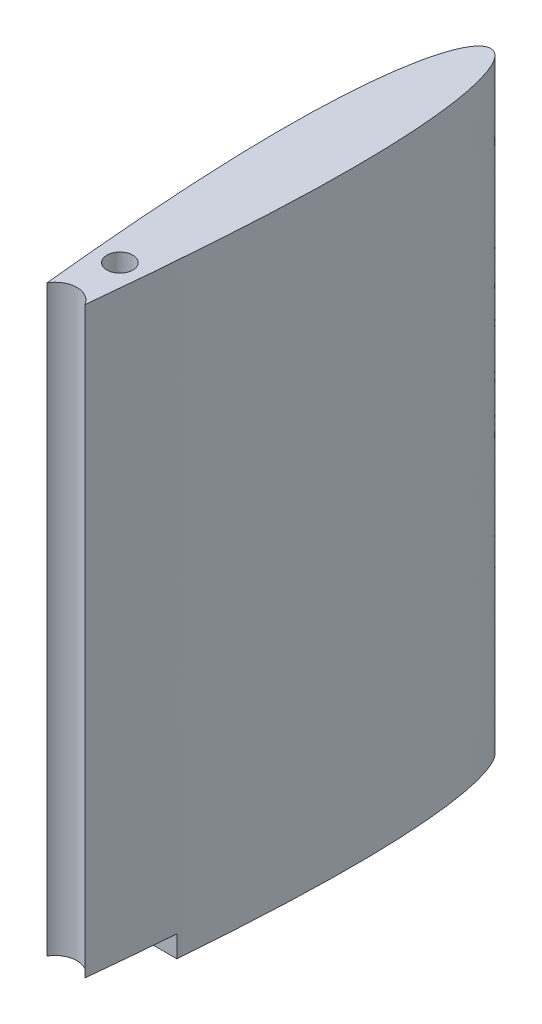
ISO-10303-21;
HEADER;
FILE_DESCRIPTION(('STEP AP214'),'2;1');
FILE_NAME('part.step','',(''),(''),'','','');
FILE_SCHEMA(('AUTOMOTIVE_DESIGN { 1 0 10303 214 1 1 1 1 }'));
ENDSEC;
DATA;
#1=APPLICATION_CONTEXT('core data for automotive mechanical design processes');
#2=APPLICATION_PROTOCOL_DEFINITION('international standard','automotive_design',2000,#1);
#3=PRODUCT_CONTEXT('',#1,'mechanical');
#4=PRODUCT('Part','Part','',(#3));
#5=PRODUCT_RELATED_PRODUCT_CATEGORY('part','',(#4));
#6=PRODUCT_DEFINITION_FORMATION('','',#4);
#7=PRODUCT_DEFINITION_CONTEXT('part definition',#1,'design');
#8=PRODUCT_DEFINITION('design','',#6,#7);
#9=PRODUCT_DEFINITION_SHAPE('','',#8);
#10=(LENGTH_UNIT() NAMED_UNIT(*) SI_UNIT(.MILLI.,.METRE.));
#11=(NAMED_UNIT(*) PLANE_ANGLE_UNIT() SI_UNIT($,.RADIAN.));
#12=(NAMED_UNIT(*) SI_UNIT($,.STERADIAN.) SOLID_ANGLE_UNIT());
#13=UNCERTAINTY_MEASURE_WITH_UNIT(LENGTH_MEASURE(1.E-05),#10,'distance_accuracy_value','');
#14=(GEOMETRIC_REPRESENTATION_CONTEXT(3) GLOBAL_UNCERTAINTY_ASSIGNED_CONTEXT((#13)) GLOBAL_UNIT_ASSIGNED_CONTEXT((#10,
#11,#12)) REPRESENTATION_CONTEXT('',''));
#15=CARTESIAN_POINT('',(0.,0.,0.));
#16=DIRECTION('',(0.,0.,1.));
#17=DIRECTION('',(1.,0.,0.));
#18=AXIS2_PLACEMENT_3D('',#15,#16,#17);
#19=CARTESIAN_POINT('',(0.,0.,51.933943359019));
#20=DIRECTION('',(0.,1.,0.));
#21=DIRECTION('',(0.,0.,1.));
#22=AXIS2_PLACEMENT_3D('',#19,#20,#21);
#23=CYLINDRICAL_SURFACE('',#22,5.04565714195597);
#24=DIRECTION('',(0.,1.,0.));
#25=VECTOR('',#24,1.);
#26=CARTESIAN_POINT('',(-4.38276807442184,0.,49.433943359019));
#27=LINE('',#26,#25);
#28=CARTESIAN_POINT('',(-4.38276807442184,5.,49.433943359019));
#29=VERTEX_POINT('',#28);
#30=CARTESIAN_POINT('',(-4.38276807442184,140.,49.433943359019));
#31=VERTEX_POINT('',#30);
#32=EDGE_CURVE('E54',#29,#31,#27,.T.);
#33=ORIENTED_EDGE('',*,*,#32,.F.);
#34=CARTESIAN_POINT('',(0.,5.,51.933943359019));
#35=DIRECTION('',(0.,-1.,0.));
#36=DIRECTION('',(0.,0.,-1.));
#37=AXIS2_PLACEMENT_3D('',#34,#35,#36);
#38=CIRCLE('',#37,5.04565714195597);
#39=CARTESIAN_POINT('',(4.38276807442184,5.,49.433943359019));
#40=VERTEX_POINT('',#39);
#41=EDGE_CURVE('E344',#40,#29,#38,.F.);
#42=ORIENTED_EDGE('',*,*,#41,.F.);
#43=DIRECTION('',(0.,1.,0.));
#44=VECTOR('',#43,1.);
#45=CARTESIAN_POINT('',(4.38276807442184,0.,49.433943359019));
#46=LINE('',#45,#44);
#47=CARTESIAN_POINT('',(4.38276807442184,140.,49.433943359019));
#48=VERTEX_POINT('',#47);
#49=EDGE_CURVE('E731',#40,#48,#46,.T.);
#50=ORIENTED_EDGE('',*,*,#49,.T.);
#51=CARTESIAN_POINT('',(0.,140.,51.933943359019));
#52=DIRECTION('',(0.,-1.,0.));
#53=DIRECTION('',(0.,0.,1.));
#54=AXIS2_PLACEMENT_3D('',#51,#52,#53);
#55=CIRCLE('',#54,5.04565714195597);
#56=EDGE_CURVE('E11',#31,#48,#55,.T.);
#57=ORIENTED_EDGE('',*,*,#56,.F.);
#58=EDGE_LOOP('',(#33,#42,#50,#57));
#59=FACE_BOUND('',#58,.T.);
#60=ADVANCED_FACE('F44',(#59),#23,.F.);
#61=CARTESIAN_POINT('',(0.,0.,-48.9294211031806));
#62=DIRECTION('',(0.,-1.,0.));
#63=DIRECTION('',(0.,0.,-1.));
#64=AXIS2_PLACEMENT_3D('',#61,#62,#63);
#65=PLANE('',#64);
#66=CARTESIAN_POINT('',(0.,0.,-23.9294211031806));
#67=DIRECTION('',(0.,-1.,0.));
#68=DIRECTION('',(0.,0.,-1.));
#69=AXIS2_PLACEMENT_3D('',#66,#67,#68);
#70=CIRCLE('',#69,2.5);
#71=CARTESIAN_POINT('',(0.,0.,-26.4294211031806));
#72=VERTEX_POINT('',#71);
#73=EDGE_CURVE('E303',#72,#72,#70,.T.);
#74=ORIENTED_EDGE('',*,*,#73,.F.);
#75=EDGE_LOOP('',(#74));
#76=FACE_BOUND('',#75,.T.);
#77=CARTESIAN_POINT('',(0.,0.,11.0705788968194));
#78=DIRECTION('',(0.,-1.,0.));
#79=DIRECTION('',(0.,0.,-1.));
#80=AXIS2_PLACEMENT_3D('',#77,#78,#79);
#81=CIRCLE('',#80,2.49999999999999);
#82=CARTESIAN_POINT('',(0.,0.,8.57057889681938));
#83=VERTEX_POINT('',#82);
#84=EDGE_CURVE('E307',#83,#83,#81,.T.);
#85=ORIENTED_EDGE('',*,*,#84,.F.);
#86=EDGE_LOOP('',(#85));
#87=FACE_BOUND('',#86,.T.);
#88=DIRECTION('',(0.999999999996919,0.,-2.48249848386067E-06));
#89=VECTOR('',#88,1.);
#90=CARTESIAN_POINT('',(7.43109690043385E-05,0.,29.9339433587668));
#91=LINE('',#90,#89);
#92=CARTESIAN_POINT('',(-6.18088512114078,0.,29.9339586936792));
#93=VERTEX_POINT('',#92);
#94=CARTESIAN_POINT('',(6.18087194615016,0.,29.9339280344539));
#95=VERTEX_POINT('',#94);
#96=EDGE_CURVE('E319',#93,#95,#91,.T.);
#97=ORIENTED_EDGE('',*,*,#96,.F.);
#98=CARTESIAN_POINT('',(4.38276807442184,0.,49.433943359019));
#99=CARTESIAN_POINT('',(7.38674027737207,0.,20.1143201093682));
#100=CARTESIAN_POINT('',(7.89819411540561,0.,-0.782057388597716));
#101=CARTESIAN_POINT('',(8.25280627032264,0.,-15.2703824405782));
#102=CARTESIAN_POINT('',(7.39775077923337,0.,-25.941839105154));
#103=CARTESIAN_POINT('',(6.8180483419731,0.,-33.1767723954968));
#104=CARTESIAN_POINT('',(5.71240319510673,0.,-38.4086579483097));
#105=CARTESIAN_POINT('',(4.94963666341469,0.,-42.0180503547607));
#106=CARTESIAN_POINT('',(3.98237547497152,0.,-44.4540468477512));
#107=CARTESIAN_POINT('',(2.20585284896571,0.,-48.9281257608461));
#108=CARTESIAN_POINT('',(0.,0.,-48.9294211031806));
#109=CARTESIAN_POINT('',(-2.20430363336308,0.,-48.9307155357698));
#110=CARTESIAN_POINT('',(-3.98237547497156,0.,-44.4540468477511));
#111=CARTESIAN_POINT('',(-4.94901413811265,0.,-42.0203313281368));
#112=CARTESIAN_POINT('',(-5.71240319510677,0.,-38.4086579483096));
#113=CARTESIAN_POINT('',(-6.81774983754667,0.,-33.1791475074594));
#114=CARTESIAN_POINT('',(-7.39775077923339,0.,-25.9418391051539));
#115=CARTESIAN_POINT('',(-8.25277773893857,0.,-15.2727291866837));
#116=CARTESIAN_POINT('',(-7.89819411540561,0.,-0.782057388597478));
#117=CARTESIAN_POINT('',(-7.38690314969791,0.,20.1127304292302));
#118=CARTESIAN_POINT('',(-4.38276807442184,0.,49.433943359019));
#119=B_SPLINE_CURVE_WITH_KNOTS('',2,(#98,#99,#100,#101,#102,#103,#104,#105,#106,#107,#108,#109,
#110,#111,#112,#113,#114,#115,#116,#117,#118),.UNSPECIFIED.,.F.,.F.,(3,2,2,2,2,2,2,2,2,2,3),(0.,
0.25,0.375,0.4375,0.46875,0.5,0.53125,0.5625,0.625,0.75,1.),.UNSPECIFIED.);
#120=EDGE_CURVE('E728',#95,#93,#119,.T.);
#121=ORIENTED_EDGE('',*,*,#120,.F.);
#122=EDGE_LOOP('',(#97,#121));
#123=FACE_BOUND('',#122,.T.);
#124=ADVANCED_FACE('F46',(#76,#87,#123),#65,.T.);
#125=CARTESIAN_POINT('',(0.,140.,-48.9294211031806));
#126=DIRECTION('',(0.,-1.,0.));
#127=DIRECTION('',(0.,0.,-1.));
#128=AXIS2_PLACEMENT_3D('',#125,#126,#127);
#129=PLANE('',#128);
#130=CARTESIAN_POINT('',(0.,140.,36.933943359019));
#131=DIRECTION('',(0.,1.,0.));
#132=DIRECTION('',(0.,0.,1.));
#133=AXIS2_PLACEMENT_3D('',#130,#131,#132);
#134=CIRCLE('',#133,3.);
#135=CARTESIAN_POINT('',(0.,140.,39.933943359019));
#136=VERTEX_POINT('',#135);
#137=EDGE_CURVE('E354',#136,#136,#134,.T.);
#138=ORIENTED_EDGE('',*,*,#137,.F.);
#139=EDGE_LOOP('',(#138));
#140=FACE_BOUND('',#139,.T.);
#141=CARTESIAN_POINT('',(4.38276807442184,140.,49.433943359019));
#142=CARTESIAN_POINT('',(7.38674027737207,140.,20.1143201093682));
#143=CARTESIAN_POINT('',(7.89819411540561,140.,-0.782057388597716));
#144=CARTESIAN_POINT('',(8.25280627032264,140.,-15.2703824405782));
#145=CARTESIAN_POINT('',(7.39775077923337,140.,-25.941839105154));
#146=CARTESIAN_POINT('',(6.8180483419731,140.,-33.1767723954968));
#147=CARTESIAN_POINT('',(5.71240319510673,140.,-38.4086579483097));
#148=CARTESIAN_POINT('',(4.94963666341469,140.,-42.0180503547607));
#149=CARTESIAN_POINT('',(3.98237547497152,140.,-44.4540468477512));
#150=CARTESIAN_POINT('',(2.20585284896571,140.,-48.9281257608461));
#151=CARTESIAN_POINT('',(0.,140.,-48.9294211031806));
#152=CARTESIAN_POINT('',(-2.20430363336308,140.,-48.9307155357698));
#153=CARTESIAN_POINT('',(-3.98237547497156,140.,-44.4540468477511));
#154=CARTESIAN_POINT('',(-4.94901413811265,140.,-42.0203313281368));
#155=CARTESIAN_POINT('',(-5.71240319510677,140.,-38.4086579483096));
#156=CARTESIAN_POINT('',(-6.81774983754667,140.,-33.1791475074594));
#157=CARTESIAN_POINT('',(-7.39775077923339,140.,-25.9418391051539));
#158=CARTESIAN_POINT('',(-8.25277773893857,140.,-15.2727291866837));
#159=CARTESIAN_POINT('',(-7.89819411540561,140.,-0.782057388597478));
#160=CARTESIAN_POINT('',(-7.38690314969791,140.,20.1127304292302));
#161=CARTESIAN_POINT('',(-4.38276807442184,140.,49.433943359019));
#162=B_SPLINE_CURVE_WITH_KNOTS('',2,(#141,#142,#143,#144,#145,#146,#147,#148,#149,#150,#151,
#152,#153,#154,#155,#156,#157,#158,#159,#160,#161),.UNSPECIFIED.,.F.,.F.,(3,2,2,2,2,2,2,2,2,2,
3),(0.,0.25,0.375,0.4375,0.46875,0.5,0.53125,0.5625,0.625,0.75,1.),.UNSPECIFIED.);
#163=EDGE_CURVE('E736',#48,#31,#162,.T.);
#164=ORIENTED_EDGE('',*,*,#163,.T.);
#165=ORIENTED_EDGE('',*,*,#56,.T.);
#166=EDGE_LOOP('',(#164,#165));
#167=FACE_BOUND('',#166,.T.);
#168=ADVANCED_FACE('F402',(#140,#167),#129,.F.);
#169=CARTESIAN_POINT('',(4.38276807442184,0.,49.433943359019));
#170=CARTESIAN_POINT('',(4.38276807442184,140.,49.433943359019));
#171=CARTESIAN_POINT('',(7.38674027737207,0.,20.1143201093682));
#172=CARTESIAN_POINT('',(7.38674027737207,140.,20.1143201093682));
#173=CARTESIAN_POINT('',(7.89819411540561,0.,-0.782057388597716));
#174=CARTESIAN_POINT('',(7.89819411540561,140.,-0.782057388597716));
#175=CARTESIAN_POINT('',(8.25280627032264,0.,-15.2703824405782));
#176=CARTESIAN_POINT('',(8.25280627032264,140.,-15.2703824405782));
#177=CARTESIAN_POINT('',(7.39775077923337,0.,-25.941839105154));
#178=CARTESIAN_POINT('',(7.39775077923337,140.,-25.941839105154));
#179=CARTESIAN_POINT('',(6.8180483419731,0.,-33.1767723954968));
#180=CARTESIAN_POINT('',(6.8180483419731,140.,-33.1767723954968));
#181=CARTESIAN_POINT('',(5.71240319510673,0.,-38.4086579483097));
#182=CARTESIAN_POINT('',(5.71240319510673,140.,-38.4086579483097));
#183=CARTESIAN_POINT('',(4.94963666341469,0.,-42.0180503547607));
#184=CARTESIAN_POINT('',(4.94963666341469,140.,-42.0180503547607));
#185=CARTESIAN_POINT('',(3.98237547497152,0.,-44.4540468477512));
#186=CARTESIAN_POINT('',(3.98237547497152,140.,-44.4540468477512));
#187=CARTESIAN_POINT('',(2.20585284896571,0.,-48.9281257608461));
#188=CARTESIAN_POINT('',(2.20585284896571,140.,-48.9281257608461));
#189=CARTESIAN_POINT('',(0.,0.,-48.9294211031806));
#190=CARTESIAN_POINT('',(0.,140.,-48.9294211031806));
#191=CARTESIAN_POINT('',(-2.20430363336308,0.,-48.9307155357698));
#192=CARTESIAN_POINT('',(-2.20430363336308,140.,-48.9307155357698));
#193=CARTESIAN_POINT('',(-3.98237547497156,0.,-44.4540468477511));
#194=CARTESIAN_POINT('',(-3.98237547497156,140.,-44.4540468477511));
#195=CARTESIAN_POINT('',(-4.94901413811265,0.,-42.0203313281368));
#196=CARTESIAN_POINT('',(-4.94901413811265,140.,-42.0203313281368));
#197=CARTESIAN_POINT('',(-5.71240319510677,0.,-38.4086579483096));
#198=CARTESIAN_POINT('',(-5.71240319510677,140.,-38.4086579483096));
#199=CARTESIAN_POINT('',(-6.81774983754667,0.,-33.1791475074594));
#200=CARTESIAN_POINT('',(-6.81774983754667,140.,-33.1791475074594));
#201=CARTESIAN_POINT('',(-7.39775077923339,0.,-25.9418391051539));
#202=CARTESIAN_POINT('',(-7.39775077923339,140.,-25.9418391051539));
#203=CARTESIAN_POINT('',(-8.25277773893857,0.,-15.2727291866837));
#204=CARTESIAN_POINT('',(-8.25277773893857,140.,-15.2727291866837));
#205=CARTESIAN_POINT('',(-7.89819411540561,0.,-0.782057388597478));
#206=CARTESIAN_POINT('',(-7.89819411540561,140.,-0.782057388597478));
#207=CARTESIAN_POINT('',(-7.38690314969791,0.,20.1127304292302));
#208=CARTESIAN_POINT('',(-7.38690314969791,140.,20.1127304292302));
#209=CARTESIAN_POINT('',(-4.38276807442184,0.,49.433943359019));
#210=CARTESIAN_POINT('',(-4.38276807442184,140.,49.433943359019));
#211=B_SPLINE_SURFACE_WITH_KNOTS('',2,1,((#169,#170),(#171,#172),(#173,#174),(#175,#176),(#177,
#178),(#179,#180),(#181,#182),(#183,#184),(#185,#186),(#187,#188),(#189,#190),(#191,#192),(#193,
#194),(#195,#196),(#197,#198),(#199,#200),(#201,#202),(#203,#204),(#205,#206),(#207,#208),(#209,
#210)),.UNSPECIFIED.,.F.,.F.,.F.,(3,2,2,2,2,2,2,2,2,2,3),(2,2),(0.,0.25,0.375,0.4375,0.46875,
0.5,0.53125,0.5625,0.625,0.75,1.),(0.,1.),.UNSPECIFIED.);
#212=DIRECTION('',(0.,-1.,0.));
#213=VECTOR('',#212,1.);
#214=CARTESIAN_POINT('',(6.18087194615016,5.,29.9339280344539));
#215=LINE('',#214,#213);
#216=CARTESIAN_POINT('',(6.18087194615016,5.,29.9339280344539));
#217=VERTEX_POINT('',#216);
#218=EDGE_CURVE('E343',#217,#95,#215,.T.);
#219=DIRECTION('',(0.,-1.,0.));
#220=VECTOR('',#219,1.);
#221=CARTESIAN_POINT('',(-6.18088512114078,5.,29.9339586936792));
#222=LINE('',#221,#220);
#223=CARTESIAN_POINT('',(-6.18088512114078,5.,29.9339586936792));
#224=VERTEX_POINT('',#223);
#225=EDGE_CURVE('E340',#224,#93,#222,.T.);
#226=CARTESIAN_POINT('',(-4.38276807442184,5.,49.433943359019));
#227=CARTESIAN_POINT('',(-7.38690314969791,5.,20.1127304292302));
#228=CARTESIAN_POINT('',(-7.89819411540561,5.,-0.782057388597478));
#229=CARTESIAN_POINT('',(-8.25277773893857,5.,-15.2727291866837));
#230=CARTESIAN_POINT('',(-7.39775077923339,5.,-25.9418391051539));
#231=CARTESIAN_POINT('',(-6.81774983754667,5.,-33.1791475074594));
#232=CARTESIAN_POINT('',(-5.71240319510677,5.,-38.4086579483096));
#233=CARTESIAN_POINT('',(-4.94901413811265,5.,-42.0203313281368));
#234=CARTESIAN_POINT('',(-3.98237547497156,5.,-44.4540468477511));
#235=CARTESIAN_POINT('',(-2.20430363336308,5.,-48.9307155357698));
#236=CARTESIAN_POINT('',(0.,5.,-48.9294211031806));
#237=CARTESIAN_POINT('',(2.20585284896571,5.,-48.9281257608461));
#238=CARTESIAN_POINT('',(3.98237547497152,5.,-44.4540468477512));
#239=CARTESIAN_POINT('',(4.94963666341469,5.,-42.0180503547607));
#240=CARTESIAN_POINT('',(5.71240319510673,5.,-38.4086579483097));
#241=CARTESIAN_POINT('',(6.8180483419731,5.,-33.1767723954968));
#242=CARTESIAN_POINT('',(7.39775077923337,5.,-25.941839105154));
#243=CARTESIAN_POINT('',(8.25280627032264,5.,-15.2703824405782));
#244=CARTESIAN_POINT('',(7.89819411540561,5.,-0.782057388597716));
#245=CARTESIAN_POINT('',(7.38674027737207,5.,20.1143201093682));
#246=CARTESIAN_POINT('',(4.38276807442184,5.,49.433943359019));
#247=B_SPLINE_CURVE_WITH_KNOTS('',2,(#226,#227,#228,#229,#230,#231,#232,#233,#234,#235,#236,
#237,#238,#239,#240,#241,#242,#243,#244,#245,#246),.UNSPECIFIED.,.F.,.F.,(3,2,2,2,2,2,2,2,2,2,
3),(0.,0.25,0.375,0.4375,0.46875,0.5,0.53125,0.5625,0.625,0.75,1.),.UNSPECIFIED.);
#248=EDGE_CURVE('E336',#29,#224,#247,.T.);
#249=EDGE_CURVE('E62',#217,#40,#247,.T.);
#250=ORIENTED_EDGE('',*,*,#218,.T.);
#251=ORIENTED_EDGE('',*,*,#120,.T.);
#252=ORIENTED_EDGE('',*,*,#225,.F.);
#253=ORIENTED_EDGE('',*,*,#248,.F.);
#254=ORIENTED_EDGE('',*,*,#32,.T.);
#255=ORIENTED_EDGE('',*,*,#163,.F.);
#256=ORIENTED_EDGE('',*,*,#49,.F.);
#257=ORIENTED_EDGE('',*,*,#249,.F.);
#258=EDGE_LOOP('',(#250,#251,#252,#253,#254,#255,#256,#257));
#259=FACE_BOUND('',#258,.T.);
#260=ADVANCED_FACE('F396',(#259),#211,.T.);
#261=CARTESIAN_POINT('',(0.,135.,36.933943359019));
#262=DIRECTION('',(0.,1.,0.));
#263=DIRECTION('',(0.,0.,1.));
#264=AXIS2_PLACEMENT_3D('',#261,#262,#263);
#265=CYLINDRICAL_SURFACE('',#264,3.);
#266=CARTESIAN_POINT('',(0.,135.,36.933943359019));
#267=DIRECTION('',(0.,1.,0.));
#268=DIRECTION('',(0.,0.,1.));
#269=AXIS2_PLACEMENT_3D('',#266,#267,#268);
#270=CIRCLE('',#269,3.);
#271=CARTESIAN_POINT('',(0.,135.,39.933943359019));
#272=VERTEX_POINT('',#271);
#273=EDGE_CURVE('E732',#272,#272,#270,.T.);
#274=ORIENTED_EDGE('',*,*,#273,.F.);
#275=EDGE_LOOP('',(#274));
#276=FACE_BOUND('',#275,.T.);
#277=ORIENTED_EDGE('',*,*,#137,.T.);
#278=EDGE_LOOP('',(#277));
#279=FACE_BOUND('',#278,.T.);
#280=ADVANCED_FACE('F404',(#276,#279),#265,.F.);
#281=CARTESIAN_POINT('',(0.,135.,36.933943359019));
#282=DIRECTION('',(0.,1.,0.));
#283=DIRECTION('',(0.,0.,1.));
#284=AXIS2_PLACEMENT_3D('',#281,#282,#283);
#285=PLANE('',#284);
#286=ORIENTED_EDGE('',*,*,#273,.T.);
#287=EDGE_LOOP('',(#286));
#288=FACE_BOUND('',#287,.T.);
#289=ADVANCED_FACE('F410',(#288),#285,.T.);
#290=CARTESIAN_POINT('',(7.43109690043385E-05,5.,29.9339433587668));
#291=DIRECTION('',(-2.48249848386067E-06,0.,-0.999999999996919));
#292=DIRECTION('',(-0.999999999996919,0.,2.48249848386067E-06));
#293=AXIS2_PLACEMENT_3D('',#290,#291,#292);
#294=PLANE('',#293);
#295=ORIENTED_EDGE('',*,*,#96,.T.);
#296=ORIENTED_EDGE('',*,*,#218,.F.);
#297=DIRECTION('',(0.999999999996919,0.,-2.48249848386067E-06));
#298=VECTOR('',#297,1.);
#299=CARTESIAN_POINT('',(7.43109690043385E-05,5.,29.9339433587668));
#300=LINE('',#299,#298);
#301=EDGE_CURVE('E327',#224,#217,#300,.T.);
#302=ORIENTED_EDGE('',*,*,#301,.F.);
#303=ORIENTED_EDGE('',*,*,#225,.T.);
#304=EDGE_LOOP('',(#295,#296,#302,#303));
#305=FACE_BOUND('',#304,.T.);
#306=ADVANCED_FACE('F424',(#305),#294,.F.);
#307=CARTESIAN_POINT('',(0.,5.,0.));
#308=DIRECTION('',(0.,-1.,0.));
#309=DIRECTION('',(0.,0.,-1.));
#310=AXIS2_PLACEMENT_3D('',#307,#308,#309);
#311=PLANE('',#310);
#312=CARTESIAN_POINT('',(0.,5.,36.933943359019));
#313=DIRECTION('',(0.,-1.,0.));
#314=DIRECTION('',(0.,0.,-1.));
#315=AXIS2_PLACEMENT_3D('',#312,#313,#314);
#316=CIRCLE('',#315,3.);
#317=CARTESIAN_POINT('',(0.,5.,33.933943359019));
#318=VERTEX_POINT('',#317);
#319=EDGE_CURVE('E302',#318,#318,#316,.T.);
#320=ORIENTED_EDGE('',*,*,#319,.F.);
#321=EDGE_LOOP('',(#320));
#322=FACE_BOUND('',#321,.T.);
#323=ORIENTED_EDGE('',*,*,#248,.T.);
#324=ORIENTED_EDGE('',*,*,#301,.T.);
#325=ORIENTED_EDGE('',*,*,#249,.T.);
#326=ORIENTED_EDGE('',*,*,#41,.T.);
#327=EDGE_LOOP('',(#323,#324,#325,#326));
#328=FACE_BOUND('',#327,.T.);
#329=ADVANCED_FACE('F427',(#322,#328),#311,.T.);
#330=CARTESIAN_POINT('',(0.,10.,36.933943359019));
#331=DIRECTION('',(0.,-1.,0.));
#332=DIRECTION('',(0.,0.,-1.));
#333=AXIS2_PLACEMENT_3D('',#330,#331,#332);
#334=CYLINDRICAL_SURFACE('',#333,3.);
#335=CARTESIAN_POINT('',(0.,10.,36.933943359019));
#336=DIRECTION('',(0.,-1.,0.));
#337=DIRECTION('',(0.,0.,-1.));
#338=AXIS2_PLACEMENT_3D('',#335,#336,#337);
#339=CIRCLE('',#338,3.);
#340=CARTESIAN_POINT('',(0.,10.,33.933943359019));
#341=VERTEX_POINT('',#340);
#342=EDGE_CURVE('E315',#341,#341,#339,.T.);
#343=ORIENTED_EDGE('',*,*,#342,.F.);
#344=EDGE_LOOP('',(#343));
#345=FACE_BOUND('',#344,.T.);
#346=ORIENTED_EDGE('',*,*,#319,.T.);
#347=EDGE_LOOP('',(#346));
#348=FACE_BOUND('',#347,.T.);
#349=ADVANCED_FACE('F431',(#345,#348),#334,.F.);
#350=CARTESIAN_POINT('',(0.,10.,36.933943359019));
#351=DIRECTION('',(0.,-1.,0.));
#352=DIRECTION('',(0.,0.,-1.));
#353=AXIS2_PLACEMENT_3D('',#350,#351,#352);
#354=PLANE('',#353);
#355=ORIENTED_EDGE('',*,*,#342,.T.);
#356=EDGE_LOOP('',(#355));
#357=FACE_BOUND('',#356,.T.);
#358=ADVANCED_FACE('F435',(#357),#354,.T.);
#359=CARTESIAN_POINT('',(0.,20.,11.0705788968194));
#360=DIRECTION('',(0.,-1.,0.));
#361=DIRECTION('',(0.,0.,-1.));
#362=AXIS2_PLACEMENT_3D('',#359,#360,#361);
#363=CYLINDRICAL_SURFACE('',#362,2.49999999999999);
#364=CARTESIAN_POINT('',(0.,3.,11.0705788968194));
#365=DIRECTION('',(0.,-1.,0.));
#366=DIRECTION('',(0.,0.,-1.));
#367=AXIS2_PLACEMENT_3D('',#364,#365,#366);
#368=CIRCLE('',#367,2.49999999999999);
#369=CARTESIAN_POINT('',(0.,3.,8.57057889681938));
#370=VERTEX_POINT('',#369);
#371=EDGE_CURVE('E48',#370,#370,#368,.F.);
#372=ORIENTED_EDGE('',*,*,#371,.T.);
#373=EDGE_LOOP('',(#372));
#374=FACE_BOUND('',#373,.T.);
#375=ORIENTED_EDGE('',*,*,#84,.T.);
#376=EDGE_LOOP('',(#375));
#377=FACE_BOUND('',#376,.T.);
#378=ADVANCED_FACE('F372',(#374,#377),#363,.F.);
#379=CARTESIAN_POINT('',(0.,20.,-23.9294211031806));
#380=DIRECTION('',(0.,-1.,0.));
#381=DIRECTION('',(0.,0.,-1.));
#382=AXIS2_PLACEMENT_3D('',#379,#380,#381);
#383=CYLINDRICAL_SURFACE('',#382,2.5);
#384=CARTESIAN_POINT('',(0.,3.,-23.9294211031806));
#385=DIRECTION('',(0.,-1.,0.));
#386=DIRECTION('',(0.,0.,-1.));
#387=AXIS2_PLACEMENT_3D('',#384,#385,#386);
#388=CIRCLE('',#387,2.5);
#389=CARTESIAN_POINT('',(0.,3.,-26.4294211031806));
#390=VERTEX_POINT('',#389);
#391=EDGE_CURVE('E360',#390,#390,#388,.F.);
#392=ORIENTED_EDGE('',*,*,#391,.T.);
#393=EDGE_LOOP('',(#392));
#394=FACE_BOUND('',#393,.T.);
#395=ORIENTED_EDGE('',*,*,#73,.T.);
#396=EDGE_LOOP('',(#395));
#397=FACE_BOUND('',#396,.T.);
#398=ADVANCED_FACE('F448',(#394,#397),#383,.F.);
#399=CARTESIAN_POINT('',(0.,3.,0.));
#400=DIRECTION('',(0.,-1.,0.));
#401=DIRECTION('',(0.,0.,-1.));
#402=AXIS2_PLACEMENT_3D('',#399,#400,#401);
#403=PLANE('',#402);
#404=DIRECTION('',(1.,0.,0.));
#405=VECTOR('',#404,1.);
#406=CARTESIAN_POINT('',(-2.30940107675848,3.,-27.9294211031806));
#407=LINE('',#406,#405);
#408=CARTESIAN_POINT('',(-2.30940107675848,3.,-27.9294211031806));
#409=VERTEX_POINT('',#408);
#410=CARTESIAN_POINT('',(2.30940107675853,3.,-27.9294211031806));
#411=VERTEX_POINT('',#410);
#412=EDGE_CURVE('E171',#409,#411,#407,.T.);
#413=ORIENTED_EDGE('',*,*,#412,.F.);
#414=DIRECTION('',(0.5,0.,-0.866025403784439));
#415=VECTOR('',#414,1.);
#416=CARTESIAN_POINT('',(-4.61880215351698,3.,-23.9294211031806));
#417=LINE('',#416,#415);
#418=CARTESIAN_POINT('',(-4.61880215351698,3.,-23.9294211031806));
#419=VERTEX_POINT('',#418);
#420=EDGE_CURVE('E225',#419,#409,#417,.T.);
#421=ORIENTED_EDGE('',*,*,#420,.F.);
#422=DIRECTION('',(-0.5,0.,-0.866025403784439));
#423=VECTOR('',#422,1.);
#424=CARTESIAN_POINT('',(-2.30940107675848,3.,-19.9294211031806));
#425=LINE('',#424,#423);
#426=CARTESIAN_POINT('',(-2.30940107675848,3.,-19.9294211031806));
#427=VERTEX_POINT('',#426);
#428=EDGE_CURVE('E222',#427,#419,#425,.T.);
#429=ORIENTED_EDGE('',*,*,#428,.F.);
#430=DIRECTION('',(-1.,0.,0.));
#431=VECTOR('',#430,1.);
#432=CARTESIAN_POINT('',(2.30940107675853,3.,-19.9294211031806));
#433=LINE('',#432,#431);
#434=CARTESIAN_POINT('',(2.30940107675853,3.,-19.9294211031806));
#435=VERTEX_POINT('',#434);
#436=EDGE_CURVE('E219',#435,#427,#433,.T.);
#437=ORIENTED_EDGE('',*,*,#436,.F.);
#438=DIRECTION('',(-0.5,0.,0.866025403784439));
#439=VECTOR('',#438,1.);
#440=CARTESIAN_POINT('',(4.61880215351703,3.,-23.9294211031806));
#441=LINE('',#440,#439);
#442=CARTESIAN_POINT('',(4.61880215351703,3.,-23.9294211031806));
#443=VERTEX_POINT('',#442);
#444=EDGE_CURVE('E216',#443,#435,#441,.T.);
#445=ORIENTED_EDGE('',*,*,#444,.F.);
#446=DIRECTION('',(0.5,0.,0.866025403784439));
#447=VECTOR('',#446,1.);
#448=CARTESIAN_POINT('',(2.30940107675853,3.,-27.9294211031806));
#449=LINE('',#448,#447);
#450=EDGE_CURVE('E213',#411,#443,#449,.T.);
#451=ORIENTED_EDGE('',*,*,#450,.F.);
#452=EDGE_LOOP('',(#413,#421,#429,#437,#445,#451));
#453=FACE_BOUND('',#452,.T.);
#454=ORIENTED_EDGE('',*,*,#391,.F.);
#455=EDGE_LOOP('',(#454));
#456=FACE_BOUND('',#455,.T.);
#457=ADVANCED_FACE('F451',(#453,#456),#403,.F.);
#458=CARTESIAN_POINT('',(0.,7.,0.));
#459=DIRECTION('',(0.,-1.,0.));
#460=DIRECTION('',(0.,0.,-1.));
#461=AXIS2_PLACEMENT_3D('',#458,#459,#460);
#462=PLANE('',#461);
#463=DIRECTION('',(1.,0.,0.));
#464=VECTOR('',#463,1.);
#465=CARTESIAN_POINT('',(-2.30940107675848,7.,-27.9294211031806));
#466=LINE('',#465,#464);
#467=CARTESIAN_POINT('',(-2.30940107675848,7.,-27.9294211031806));
#468=VERTEX_POINT('',#467);
#469=CARTESIAN_POINT('',(2.30940107675853,7.,-27.9294211031806));
#470=VERTEX_POINT('',#469);
#471=EDGE_CURVE('E168',#468,#470,#466,.T.);
#472=ORIENTED_EDGE('',*,*,#471,.T.);
#473=DIRECTION('',(0.5,0.,0.866025403784439));
#474=VECTOR('',#473,1.);
#475=CARTESIAN_POINT('',(2.30940107675853,7.,-27.9294211031806));
#476=LINE('',#475,#474);
#477=CARTESIAN_POINT('',(4.61880215351703,7.,-23.9294211031806));
#478=VERTEX_POINT('',#477);
#479=EDGE_CURVE('E178',#470,#478,#476,.T.);
#480=ORIENTED_EDGE('',*,*,#479,.T.);
#481=DIRECTION('',(-0.5,0.,0.866025403784439));
#482=VECTOR('',#481,1.);
#483=CARTESIAN_POINT('',(4.61880215351703,7.,-23.9294211031806));
#484=LINE('',#483,#482);
#485=CARTESIAN_POINT('',(2.30940107675853,7.,-19.9294211031806));
#486=VERTEX_POINT('',#485);
#487=EDGE_CURVE('E185',#478,#486,#484,.T.);
#488=ORIENTED_EDGE('',*,*,#487,.T.);
#489=DIRECTION('',(-1.,0.,0.));
#490=VECTOR('',#489,1.);
#491=CARTESIAN_POINT('',(2.30940107675853,7.,-19.9294211031806));
#492=LINE('',#491,#490);
#493=CARTESIAN_POINT('',(-2.30940107675848,7.,-19.9294211031806));
#494=VERTEX_POINT('',#493);
#495=EDGE_CURVE('E202',#486,#494,#492,.T.);
#496=ORIENTED_EDGE('',*,*,#495,.T.);
#497=DIRECTION('',(-0.5,0.,-0.866025403784439));
#498=VECTOR('',#497,1.);
#499=CARTESIAN_POINT('',(-2.30940107675848,7.,-19.9294211031806));
#500=LINE('',#499,#498);
#501=CARTESIAN_POINT('',(-4.61880215351698,7.,-23.9294211031806));
#502=VERTEX_POINT('',#501);
#503=EDGE_CURVE('E206',#494,#502,#500,.T.);
#504=ORIENTED_EDGE('',*,*,#503,.T.);
#505=DIRECTION('',(0.5,0.,-0.866025403784439));
#506=VECTOR('',#505,1.);
#507=CARTESIAN_POINT('',(-4.61880215351698,7.,-23.9294211031806));
#508=LINE('',#507,#506);
#509=EDGE_CURVE('E191',#502,#468,#508,.T.);
#510=ORIENTED_EDGE('',*,*,#509,.T.);
#511=EDGE_LOOP('',(#472,#480,#488,#496,#504,#510));
#512=FACE_BOUND('',#511,.T.);
#513=CARTESIAN_POINT('',(0.,7.,-23.9294211031806));
#514=DIRECTION('',(0.,-1.,0.));
#515=DIRECTION('',(0.,0.,-1.));
#516=AXIS2_PLACEMENT_3D('',#513,#514,#515);
#517=CIRCLE('',#516,2.5);
#518=CARTESIAN_POINT('',(0.,7.,-26.4294211031806));
#519=VERTEX_POINT('',#518);
#520=EDGE_CURVE('E174',#519,#519,#517,.F.);
#521=ORIENTED_EDGE('',*,*,#520,.T.);
#522=EDGE_LOOP('',(#521));
#523=FACE_BOUND('',#522,.T.);
#524=ADVANCED_FACE('F187',(#512,#523),#462,.T.);
#525=CARTESIAN_POINT('',(-2.30940107675848,3.,-27.9294211031806));
#526=DIRECTION('',(0.,0.,1.));
#527=DIRECTION('',(1.,0.,0.));
#528=AXIS2_PLACEMENT_3D('',#525,#526,#527);
#529=PLANE('',#528);
#530=DIRECTION('',(0.,1.,0.));
#531=VECTOR('',#530,1.);
#532=CARTESIAN_POINT('',(-2.30940107675848,3.,-27.9294211031806));
#533=LINE('',#532,#531);
#534=EDGE_CURVE('E228',#409,#468,#533,.T.);
#535=ORIENTED_EDGE('',*,*,#534,.F.);
#536=ORIENTED_EDGE('',*,*,#412,.T.);
#537=DIRECTION('',(0.,1.,0.));
#538=VECTOR('',#537,1.);
#539=CARTESIAN_POINT('',(2.30940107675853,3.,-27.9294211031806));
#540=LINE('',#539,#538);
#541=EDGE_CURVE('E163',#411,#470,#540,.T.);
#542=ORIENTED_EDGE('',*,*,#541,.T.);
#543=ORIENTED_EDGE('',*,*,#471,.F.);
#544=EDGE_LOOP('',(#535,#536,#542,#543));
#545=FACE_BOUND('',#544,.T.);
#546=ADVANCED_FACE('F166',(#545),#529,.T.);
#547=CARTESIAN_POINT('',(2.30940107675853,3.,-27.9294211031806));
#548=DIRECTION('',(-0.866025403784439,0.,0.5));
#549=DIRECTION('',(0.5,0.,0.866025403784439));
#550=AXIS2_PLACEMENT_3D('',#547,#548,#549);
#551=PLANE('',#550);
#552=ORIENTED_EDGE('',*,*,#541,.F.);
#553=ORIENTED_EDGE('',*,*,#450,.T.);
#554=DIRECTION('',(0.,1.,0.));
#555=VECTOR('',#554,1.);
#556=CARTESIAN_POINT('',(4.61880215351703,3.,-23.9294211031806));
#557=LINE('',#556,#555);
#558=EDGE_CURVE('E175',#443,#478,#557,.T.);
#559=ORIENTED_EDGE('',*,*,#558,.T.);
#560=ORIENTED_EDGE('',*,*,#479,.F.);
#561=EDGE_LOOP('',(#552,#553,#559,#560));
#562=FACE_BOUND('',#561,.T.);
#563=ADVANCED_FACE('F179',(#562),#551,.T.);
#564=CARTESIAN_POINT('',(4.61880215351703,3.,-23.9294211031806));
#565=DIRECTION('',(-0.866025403784439,0.,-0.5));
#566=DIRECTION('',(-0.5,0.,0.866025403784439));
#567=AXIS2_PLACEMENT_3D('',#564,#565,#566);
#568=PLANE('',#567);
#569=ORIENTED_EDGE('',*,*,#558,.F.);
#570=ORIENTED_EDGE('',*,*,#444,.T.);
#571=DIRECTION('',(0.,1.,0.));
#572=VECTOR('',#571,1.);
#573=CARTESIAN_POINT('',(2.30940107675853,3.,-19.9294211031806));
#574=LINE('',#573,#572);
#575=EDGE_CURVE('E237',#435,#486,#574,.T.);
#576=ORIENTED_EDGE('',*,*,#575,.T.);
#577=ORIENTED_EDGE('',*,*,#487,.F.);
#578=EDGE_LOOP('',(#569,#570,#576,#577));
#579=FACE_BOUND('',#578,.T.);
#580=ADVANCED_FACE('F483',(#579),#568,.T.);
#581=CARTESIAN_POINT('',(2.30940107675853,3.,-19.9294211031806));
#582=DIRECTION('',(0.,0.,-1.));
#583=DIRECTION('',(-1.,0.,0.));
#584=AXIS2_PLACEMENT_3D('',#581,#582,#583);
#585=PLANE('',#584);
#586=ORIENTED_EDGE('',*,*,#575,.F.);
#587=ORIENTED_EDGE('',*,*,#436,.T.);
#588=DIRECTION('',(0.,1.,0.));
#589=VECTOR('',#588,1.);
#590=CARTESIAN_POINT('',(-2.30940107675848,3.,-19.9294211031806));
#591=LINE('',#590,#589);
#592=EDGE_CURVE('E234',#427,#494,#591,.T.);
#593=ORIENTED_EDGE('',*,*,#592,.T.);
#594=ORIENTED_EDGE('',*,*,#495,.F.);
#595=EDGE_LOOP('',(#586,#587,#593,#594));
#596=FACE_BOUND('',#595,.T.);
#597=ADVANCED_FACE('F479',(#596),#585,.T.);
#598=CARTESIAN_POINT('',(-2.30940107675848,3.,-19.9294211031806));
#599=DIRECTION('',(0.866025403784439,0.,-0.5));
#600=DIRECTION('',(-0.5,0.,-0.866025403784439));
#601=AXIS2_PLACEMENT_3D('',#598,#599,#600);
#602=PLANE('',#601);
#603=ORIENTED_EDGE('',*,*,#592,.F.);
#604=ORIENTED_EDGE('',*,*,#428,.T.);
#605=DIRECTION('',(0.,1.,0.));
#606=VECTOR('',#605,1.);
#607=CARTESIAN_POINT('',(-4.61880215351698,3.,-23.9294211031806));
#608=LINE('',#607,#606);
#609=EDGE_CURVE('E231',#419,#502,#608,.T.);
#610=ORIENTED_EDGE('',*,*,#609,.T.);
#611=ORIENTED_EDGE('',*,*,#503,.F.);
#612=EDGE_LOOP('',(#603,#604,#610,#611));
#613=FACE_BOUND('',#612,.T.);
#614=ADVANCED_FACE('F388',(#613),#602,.T.);
#615=CARTESIAN_POINT('',(-4.61880215351698,3.,-23.9294211031806));
#616=DIRECTION('',(0.866025403784439,0.,0.5));
#617=DIRECTION('',(0.5,0.,-0.866025403784439));
#618=AXIS2_PLACEMENT_3D('',#615,#616,#617);
#619=PLANE('',#618);
#620=ORIENTED_EDGE('',*,*,#609,.F.);
#621=ORIENTED_EDGE('',*,*,#420,.T.);
#622=ORIENTED_EDGE('',*,*,#534,.T.);
#623=ORIENTED_EDGE('',*,*,#509,.F.);
#624=EDGE_LOOP('',(#620,#621,#622,#623));
#625=FACE_BOUND('',#624,.T.);
#626=ADVANCED_FACE('F378',(#625),#619,.T.);
#627=CARTESIAN_POINT('',(0.,3.,0.));
#628=DIRECTION('',(0.,-1.,0.));
#629=DIRECTION('',(0.,0.,-1.));
#630=AXIS2_PLACEMENT_3D('',#627,#628,#629);
#631=PLANE('',#630);
#632=DIRECTION('',(0.504180083359854,0.,-0.863598543041413));
#633=VECTOR('',#632,1.);
#634=CARTESIAN_POINT('',(-4.61874819955707,3.,11.0482539685669));
#635=LINE('',#634,#633);
#636=CARTESIAN_POINT('',(-4.61874819955707,3.,11.0482539685669));
#637=VERTEX_POINT('',#636);
#638=CARTESIAN_POINT('',(-2.29004014477419,3.,7.05946315819305));
#639=VERTEX_POINT('',#638);
#640=EDGE_CURVE('E275',#637,#639,#635,.T.);
#641=ORIENTED_EDGE('',*,*,#640,.F.);
#642=DIRECTION('',(-0.495808235265166,0.,-0.868432031792496));
#643=VECTOR('',#642,1.);
#644=CARTESIAN_POINT('',(-2.32870805478285,3.,15.0593697071932));
#645=LINE('',#644,#643);
#646=CARTESIAN_POINT('',(-2.32870805478285,3.,15.0593697071932));
#647=VERTEX_POINT('',#646);
#648=EDGE_CURVE('E260',#647,#637,#645,.T.);
#649=ORIENTED_EDGE('',*,*,#648,.F.);
#650=DIRECTION('',(-0.999988318625019,0.,-0.0048334887510832));
#651=VECTOR('',#650,1.);
#652=CARTESIAN_POINT('',(2.29004014477424,3.,15.0816946354457));
#653=LINE('',#652,#651);
#654=CARTESIAN_POINT('',(2.29004014477424,3.,15.0816946354457));
#655=VERTEX_POINT('',#654);
#656=EDGE_CURVE('E263',#655,#647,#653,.T.);
#657=ORIENTED_EDGE('',*,*,#656,.F.);
#658=DIRECTION('',(-0.504180083359854,0.,0.863598543041413));
#659=VECTOR('',#658,1.);
#660=CARTESIAN_POINT('',(4.61874819955711,3.,11.0929038250719));
#661=LINE('',#660,#659);
#662=CARTESIAN_POINT('',(4.61874819955711,3.,11.0929038250719));
#663=VERTEX_POINT('',#662);
#664=EDGE_CURVE('E266',#663,#655,#661,.T.);
#665=ORIENTED_EDGE('',*,*,#664,.F.);
#666=DIRECTION('',(0.495808235265166,0.,0.868432031792496));
#667=VECTOR('',#666,1.);
#668=CARTESIAN_POINT('',(2.3287080547829,3.,7.08178808644555));
#669=LINE('',#668,#667);
#670=CARTESIAN_POINT('',(2.3287080547829,3.,7.08178808644555));
#671=VERTEX_POINT('',#670);
#672=EDGE_CURVE('E269',#671,#663,#669,.T.);
#673=ORIENTED_EDGE('',*,*,#672,.F.);
#674=DIRECTION('',(0.999988318625019,0.,0.00483348875108301));
#675=VECTOR('',#674,1.);
#676=CARTESIAN_POINT('',(-2.29004014477419,3.,7.05946315819305));
#677=LINE('',#676,#675);
#678=EDGE_CURVE('E272',#639,#671,#677,.T.);
#679=ORIENTED_EDGE('',*,*,#678,.F.);
#680=EDGE_LOOP('',(#641,#649,#657,#665,#673,#679));
#681=FACE_BOUND('',#680,.T.);
#682=ORIENTED_EDGE('',*,*,#371,.F.);
#683=EDGE_LOOP('',(#682));
#684=FACE_BOUND('',#683,.T.);
#685=ADVANCED_FACE('F375',(#681,#684),#631,.F.);
#686=CARTESIAN_POINT('',(0.,7.,0.));
#687=DIRECTION('',(0.,-1.,0.));
#688=DIRECTION('',(0.,0.,-1.));
#689=AXIS2_PLACEMENT_3D('',#686,#687,#688);
#690=PLANE('',#689);
#691=DIRECTION('',(0.504180083359854,0.,-0.863598543041413));
#692=VECTOR('',#691,1.);
#693=CARTESIAN_POINT('',(-4.61874819955707,7.,11.0482539685669));
#694=LINE('',#693,#692);
#695=CARTESIAN_POINT('',(-4.61874819955707,7.,11.0482539685669));
#696=VERTEX_POINT('',#695);
#697=CARTESIAN_POINT('',(-2.29004014477419,7.,7.05946315819305));
#698=VERTEX_POINT('',#697);
#699=EDGE_CURVE('E193',#696,#698,#694,.T.);
#700=ORIENTED_EDGE('',*,*,#699,.T.);
#701=DIRECTION('',(0.999988318625019,0.,0.00483348875108301));
#702=VECTOR('',#701,1.);
#703=CARTESIAN_POINT('',(-2.29004014477419,7.,7.05946315819305));
#704=LINE('',#703,#702);
#705=CARTESIAN_POINT('',(2.3287080547829,7.,7.08178808644555));
#706=VERTEX_POINT('',#705);
#707=EDGE_CURVE('E197',#698,#706,#704,.T.);
#708=ORIENTED_EDGE('',*,*,#707,.T.);
#709=DIRECTION('',(0.495808235265166,0.,0.868432031792496));
#710=VECTOR('',#709,1.);
#711=CARTESIAN_POINT('',(2.3287080547829,7.,7.08178808644555));
#712=LINE('',#711,#710);
#713=CARTESIAN_POINT('',(4.61874819955711,7.,11.0929038250719));
#714=VERTEX_POINT('',#713);
#715=EDGE_CURVE('E291',#706,#714,#712,.T.);
#716=ORIENTED_EDGE('',*,*,#715,.T.);
#717=DIRECTION('',(-0.504180083359854,0.,0.863598543041413));
#718=VECTOR('',#717,1.);
#719=CARTESIAN_POINT('',(4.61874819955711,7.,11.0929038250719));
#720=LINE('',#719,#718);
#721=CARTESIAN_POINT('',(2.29004014477424,7.,15.0816946354457));
#722=VERTEX_POINT('',#721);
#723=EDGE_CURVE('E287',#714,#722,#720,.T.);
#724=ORIENTED_EDGE('',*,*,#723,.T.);
#725=DIRECTION('',(-0.999988318625019,0.,-0.0048334887510832));
#726=VECTOR('',#725,1.);
#727=CARTESIAN_POINT('',(2.29004014477424,7.,15.0816946354457));
#728=LINE('',#727,#726);
#729=CARTESIAN_POINT('',(-2.32870805478285,7.,15.0593697071932));
#730=VERTEX_POINT('',#729);
#731=EDGE_CURVE('E283',#722,#730,#728,.T.);
#732=ORIENTED_EDGE('',*,*,#731,.T.);
#733=DIRECTION('',(-0.495808235265166,0.,-0.868432031792496));
#734=VECTOR('',#733,1.);
#735=CARTESIAN_POINT('',(-2.32870805478285,7.,15.0593697071932));
#736=LINE('',#735,#734);
#737=EDGE_CURVE('E279',#730,#696,#736,.T.);
#738=ORIENTED_EDGE('',*,*,#737,.T.);
#739=EDGE_LOOP('',(#700,#708,#716,#724,#732,#738));
#740=FACE_BOUND('',#739,.T.);
#741=CARTESIAN_POINT('',(0.,7.,11.0705788968194));
#742=DIRECTION('',(0.,-1.,0.));
#743=DIRECTION('',(0.,0.,-1.));
#744=AXIS2_PLACEMENT_3D('',#741,#742,#743);
#745=CIRCLE('',#744,2.49999999999999);
#746=CARTESIAN_POINT('',(0.,7.,8.57057889681938));
#747=VERTEX_POINT('',#746);
#748=EDGE_CURVE('E363',#747,#747,#745,.F.);
#749=ORIENTED_EDGE('',*,*,#748,.T.);
#750=EDGE_LOOP('',(#749));
#751=FACE_BOUND('',#750,.T.);
#752=ADVANCED_FACE('F377',(#740,#751),#690,.T.);
#753=CARTESIAN_POINT('',(-4.61874819955707,3.,11.0482539685669));
#754=DIRECTION('',(0.863598543041413,0.,0.504180083359854));
#755=DIRECTION('',(0.504180083359854,0.,-0.863598543041413));
#756=AXIS2_PLACEMENT_3D('',#753,#754,#755);
#757=PLANE('',#756);
#758=DIRECTION('',(0.,1.,0.));
#759=VECTOR('',#758,1.);
#760=CARTESIAN_POINT('',(-4.61874819955707,3.,11.0482539685669));
#761=LINE('',#760,#759);
#762=EDGE_CURVE('E257',#637,#696,#761,.T.);
#763=ORIENTED_EDGE('',*,*,#762,.F.);
#764=ORIENTED_EDGE('',*,*,#640,.T.);
#765=DIRECTION('',(0.,1.,0.));
#766=VECTOR('',#765,1.);
#767=CARTESIAN_POINT('',(-2.29004014477419,3.,7.05946315819305));
#768=LINE('',#767,#766);
#769=EDGE_CURVE('E242',#639,#698,#768,.T.);
#770=ORIENTED_EDGE('',*,*,#769,.T.);
#771=ORIENTED_EDGE('',*,*,#699,.F.);
#772=EDGE_LOOP('',(#763,#764,#770,#771));
#773=FACE_BOUND('',#772,.T.);
#774=ADVANCED_FACE('F385',(#773),#757,.T.);
#775=CARTESIAN_POINT('',(-2.29004014477419,3.,7.05946315819305));
#776=DIRECTION('',(-0.00483348875108301,0.,0.999988318625019));
#777=DIRECTION('',(0.999988318625019,0.,0.00483348875108301));
#778=AXIS2_PLACEMENT_3D('',#775,#776,#777);
#779=PLANE('',#778);
#780=ORIENTED_EDGE('',*,*,#769,.F.);
#781=ORIENTED_EDGE('',*,*,#678,.T.);
#782=DIRECTION('',(0.,1.,0.));
#783=VECTOR('',#782,1.);
#784=CARTESIAN_POINT('',(2.3287080547829,3.,7.08178808644555));
#785=LINE('',#784,#783);
#786=EDGE_CURVE('E245',#671,#706,#785,.T.);
#787=ORIENTED_EDGE('',*,*,#786,.T.);
#788=ORIENTED_EDGE('',*,*,#707,.F.);
#789=EDGE_LOOP('',(#780,#781,#787,#788));
#790=FACE_BOUND('',#789,.T.);
#791=ADVANCED_FACE('F492',(#790),#779,.T.);
#792=CARTESIAN_POINT('',(2.3287080547829,3.,7.08178808644555));
#793=DIRECTION('',(-0.868432031792496,0.,0.495808235265166));
#794=DIRECTION('',(0.495808235265166,0.,0.868432031792496));
#795=AXIS2_PLACEMENT_3D('',#792,#793,#794);
#796=PLANE('',#795);
#797=ORIENTED_EDGE('',*,*,#786,.F.);
#798=ORIENTED_EDGE('',*,*,#672,.T.);
#799=DIRECTION('',(0.,1.,0.));
#800=VECTOR('',#799,1.);
#801=CARTESIAN_POINT('',(4.61874819955711,3.,11.0929038250719));
#802=LINE('',#801,#800);
#803=EDGE_CURVE('E248',#663,#714,#802,.T.);
#804=ORIENTED_EDGE('',*,*,#803,.T.);
#805=ORIENTED_EDGE('',*,*,#715,.F.);
#806=EDGE_LOOP('',(#797,#798,#804,#805));
#807=FACE_BOUND('',#806,.T.);
#808=ADVANCED_FACE('F496',(#807),#796,.T.);
#809=CARTESIAN_POINT('',(4.61874819955711,3.,11.0929038250719));
#810=DIRECTION('',(-0.863598543041413,0.,-0.504180083359854));
#811=DIRECTION('',(-0.504180083359854,0.,0.863598543041413));
#812=AXIS2_PLACEMENT_3D('',#809,#810,#811);
#813=PLANE('',#812);
#814=ORIENTED_EDGE('',*,*,#803,.F.);
#815=ORIENTED_EDGE('',*,*,#664,.T.);
#816=DIRECTION('',(0.,1.,0.));
#817=VECTOR('',#816,1.);
#818=CARTESIAN_POINT('',(2.29004014477424,3.,15.0816946354457));
#819=LINE('',#818,#817);
#820=EDGE_CURVE('E251',#655,#722,#819,.T.);
#821=ORIENTED_EDGE('',*,*,#820,.T.);
#822=ORIENTED_EDGE('',*,*,#723,.F.);
#823=EDGE_LOOP('',(#814,#815,#821,#822));
#824=FACE_BOUND('',#823,.T.);
#825=ADVANCED_FACE('F500',(#824),#813,.T.);
#826=CARTESIAN_POINT('',(2.29004014477424,3.,15.0816946354457));
#827=DIRECTION('',(0.0048334887510832,0.,-0.999988318625019));
#828=DIRECTION('',(-0.999988318625019,0.,-0.0048334887510832));
#829=AXIS2_PLACEMENT_3D('',#826,#827,#828);
#830=PLANE('',#829);
#831=ORIENTED_EDGE('',*,*,#820,.F.);
#832=ORIENTED_EDGE('',*,*,#656,.T.);
#833=DIRECTION('',(0.,1.,0.));
#834=VECTOR('',#833,1.);
#835=CARTESIAN_POINT('',(-2.32870805478285,3.,15.0593697071932));
#836=LINE('',#835,#834);
#837=EDGE_CURVE('E254',#647,#730,#836,.T.);
#838=ORIENTED_EDGE('',*,*,#837,.T.);
#839=ORIENTED_EDGE('',*,*,#731,.F.);
#840=EDGE_LOOP('',(#831,#832,#838,#839));
#841=FACE_BOUND('',#840,.T.);
#842=ADVANCED_FACE('F462',(#841),#830,.T.);
#843=CARTESIAN_POINT('',(-2.32870805478285,3.,15.0593697071932));
#844=DIRECTION('',(0.868432031792496,0.,-0.495808235265166));
#845=DIRECTION('',(-0.495808235265166,0.,-0.868432031792496));
#846=AXIS2_PLACEMENT_3D('',#843,#844,#845);
#847=PLANE('',#846);
#848=ORIENTED_EDGE('',*,*,#837,.F.);
#849=ORIENTED_EDGE('',*,*,#648,.T.);
#850=ORIENTED_EDGE('',*,*,#762,.T.);
#851=ORIENTED_EDGE('',*,*,#737,.F.);
#852=EDGE_LOOP('',(#848,#849,#850,#851));
#853=FACE_BOUND('',#852,.T.);
#854=ADVANCED_FACE('F455',(#853),#847,.T.);
#855=CARTESIAN_POINT('',(0.,20.,-23.9294211031806));
#856=DIRECTION('',(0.,-1.,0.));
#857=DIRECTION('',(0.,0.,-1.));
#858=AXIS2_PLACEMENT_3D('',#855,#856,#857);
#859=PLANE('',#858);
#860=CARTESIAN_POINT('',(0.,20.,-23.9294211031806));
#861=DIRECTION('',(0.,-1.,0.));
#862=DIRECTION('',(0.,0.,-1.));
#863=AXIS2_PLACEMENT_3D('',#860,#861,#862);
#864=CIRCLE('',#863,2.5);
#865=CARTESIAN_POINT('',(0.,20.,-26.4294211031806));
#866=VERTEX_POINT('',#865);
#867=EDGE_CURVE('E298',#866,#866,#864,.T.);
#868=ORIENTED_EDGE('',*,*,#867,.T.);
#869=EDGE_LOOP('',(#868));
#870=FACE_BOUND('',#869,.T.);
#871=ADVANCED_FACE('F453',(#870),#859,.T.);
#872=ORIENTED_EDGE('',*,*,#867,.F.);
#873=EDGE_LOOP('',(#872));
#874=FACE_BOUND('',#873,.T.);
#875=ORIENTED_EDGE('',*,*,#520,.F.);
#876=EDGE_LOOP('',(#875));
#877=FACE_BOUND('',#876,.T.);
#878=ADVANCED_FACE('F444',(#874,#877),#383,.F.);
#879=CARTESIAN_POINT('',(0.,20.,11.0705788968194));
#880=DIRECTION('',(0.,-1.,0.));
#881=DIRECTION('',(0.,0.,-1.));
#882=AXIS2_PLACEMENT_3D('',#879,#880,#881);
#883=PLANE('',#882);
#884=CARTESIAN_POINT('',(0.,20.,11.0705788968194));
#885=DIRECTION('',(0.,-1.,0.));
#886=DIRECTION('',(0.,0.,-1.));
#887=AXIS2_PLACEMENT_3D('',#884,#885,#886);
#888=CIRCLE('',#887,2.49999999999999);
#889=CARTESIAN_POINT('',(0.,20.,8.57057889681938));
#890=VERTEX_POINT('',#889);
#891=EDGE_CURVE('E311',#890,#890,#888,.T.);
#892=ORIENTED_EDGE('',*,*,#891,.T.);
#893=EDGE_LOOP('',(#892));
#894=FACE_BOUND('',#893,.T.);
#895=ADVANCED_FACE('F440',(#894),#883,.T.);
#896=ORIENTED_EDGE('',*,*,#891,.F.);
#897=EDGE_LOOP('',(#896));
#898=FACE_BOUND('',#897,.T.);
#899=ORIENTED_EDGE('',*,*,#748,.F.);
#900=EDGE_LOOP('',(#899));
#901=FACE_BOUND('',#900,.T.);
#902=ADVANCED_FACE('F443',(#898,#901),#363,.F.);
#903=CLOSED_SHELL('',(#60,#124,#168,#260,#280,#289,#306,#329,#349,#358,#378,#398,#457,#524,#546,
#563,#580,#597,#614,#626,#685,#752,#774,#791,#808,#825,#842,#854,#871,#878,#895,#902));
#904=MANIFOLD_SOLID_BREP('B2',#903);
#905=ADVANCED_BREP_SHAPE_REPRESENTATION('',(#18,#904),#14);
#906=SHAPE_DEFINITION_REPRESENTATION(#9,#905);
ENDSEC;
END-ISO-10303-21;
